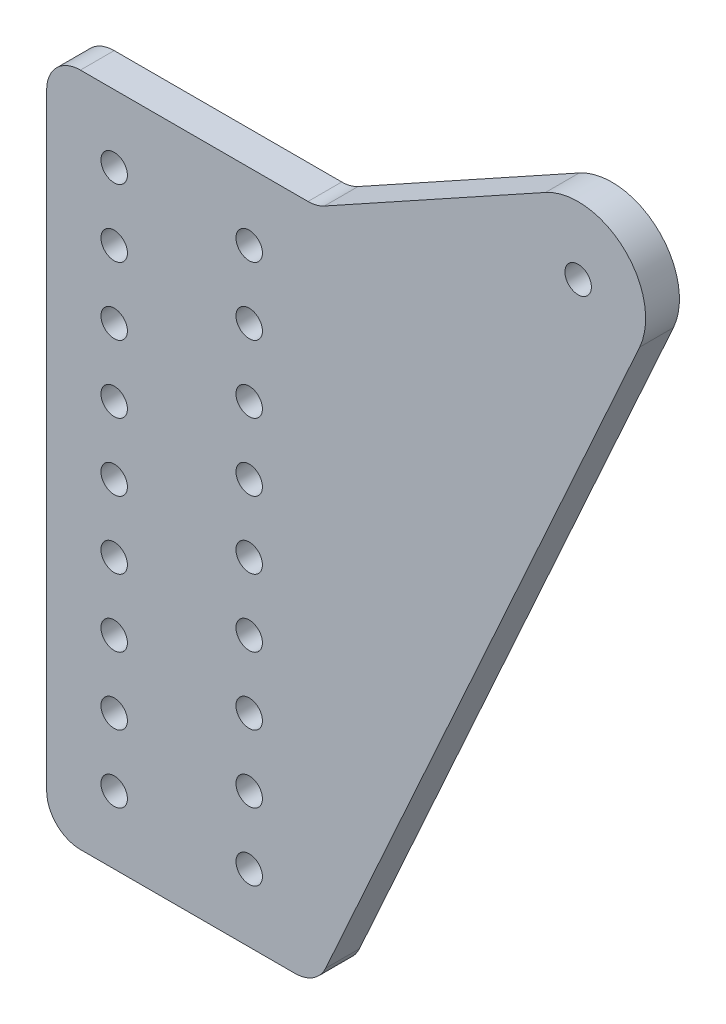
ISO-10303-21;
HEADER;
FILE_DESCRIPTION(('STEP AP214'),'2;1');
FILE_NAME('part.step','',(''),(''),'','','');
FILE_SCHEMA(('AUTOMOTIVE_DESIGN { 1 0 10303 214 1 1 1 1 }'));
ENDSEC;
DATA;
#1=APPLICATION_CONTEXT('core data for automotive mechanical design processes');
#2=APPLICATION_PROTOCOL_DEFINITION('international standard','automotive_design',2000,#1);
#3=PRODUCT_CONTEXT('',#1,'mechanical');
#4=PRODUCT('Part','Part','',(#3));
#5=PRODUCT_RELATED_PRODUCT_CATEGORY('part','',(#4));
#6=PRODUCT_DEFINITION_FORMATION('','',#4);
#7=PRODUCT_DEFINITION_CONTEXT('part definition',#1,'design');
#8=PRODUCT_DEFINITION('design','',#6,#7);
#9=PRODUCT_DEFINITION_SHAPE('','',#8);
#10=(LENGTH_UNIT() NAMED_UNIT(*) SI_UNIT(.MILLI.,.METRE.));
#11=(NAMED_UNIT(*) PLANE_ANGLE_UNIT() SI_UNIT($,.RADIAN.));
#12=(NAMED_UNIT(*) SI_UNIT($,.STERADIAN.) SOLID_ANGLE_UNIT());
#13=UNCERTAINTY_MEASURE_WITH_UNIT(LENGTH_MEASURE(1.E-05),#10,'distance_accuracy_value','');
#14=(GEOMETRIC_REPRESENTATION_CONTEXT(3) GLOBAL_UNCERTAINTY_ASSIGNED_CONTEXT((#13)) GLOBAL_UNIT_ASSIGNED_CONTEXT((#10,
#11,#12)) REPRESENTATION_CONTEXT('',''));
#15=CARTESIAN_POINT('',(0.,0.,0.));
#16=DIRECTION('',(0.,0.,1.));
#17=DIRECTION('',(1.,0.,0.));
#18=AXIS2_PLACEMENT_3D('',#15,#16,#17);
#19=CARTESIAN_POINT('',(-14.470826659618,6.53887304743332,-6.35));
#20=DIRECTION('',(0.911284099188198,-0.411778205550943,0.));
#21=DIRECTION('',(0.411778205550943,0.911284099188198,0.));
#22=AXIS2_PLACEMENT_3D('',#19,#20,#21);
#23=PLANE('',#22);
#24=DIRECTION('',(0.411778205550943,0.911284099188198,0.));
#25=VECTOR('',#24,1.);
#26=CARTESIAN_POINT('',(-14.470826659618,6.53887304743332,0.));
#27=LINE('',#26,#25);
#28=CARTESIAN_POINT('',(141.387813286241,351.461208394752,0.));
#29=VERTEX_POINT('',#28);
#30=CARTESIAN_POINT('',(200.461068727398,482.193038406938,0.));
#31=VERTEX_POINT('',#30);
#32=EDGE_CURVE('E149',#29,#31,#27,.T.);
#33=ORIENTED_EDGE('',*,*,#32,.F.);
#34=DIRECTION('',(0.,0.,1.));
#35=VECTOR('',#34,1.);
#36=CARTESIAN_POINT('',(141.387813286241,351.461208394752,-6.35));
#37=LINE('',#36,#35);
#38=CARTESIAN_POINT('',(141.387813286241,351.461208394752,-6.35));
#39=VERTEX_POINT('',#38);
#40=EDGE_CURVE('E56',#29,#39,#37,.F.);
#41=ORIENTED_EDGE('',*,*,#40,.T.);
#42=DIRECTION('',(0.411778205550943,0.911284099188198,0.));
#43=VECTOR('',#42,1.);
#44=CARTESIAN_POINT('',(-14.470826659618,6.53887304743332,-6.35));
#45=LINE('',#44,#43);
#46=CARTESIAN_POINT('',(200.461068727398,482.193038406938,-6.35));
#47=VERTEX_POINT('',#46);
#48=EDGE_CURVE('E117',#39,#47,#45,.T.);
#49=ORIENTED_EDGE('',*,*,#48,.T.);
#50=DIRECTION('',(0.,0.,1.));
#51=VECTOR('',#50,1.);
#52=CARTESIAN_POINT('',(200.461068727398,482.193038406938,-6.35));
#53=LINE('',#52,#51);
#54=EDGE_CURVE('E119',#47,#31,#53,.T.);
#55=ORIENTED_EDGE('',*,*,#54,.T.);
#56=EDGE_LOOP('',(#33,#41,#49,#55));
#57=FACE_BOUND('',#56,.T.);
#58=ADVANCED_FACE('F41',(#57),#23,.T.);
#59=CARTESIAN_POINT('',(0.,347.726,-6.35));
#60=DIRECTION('',(0.,-1.,0.));
#61=DIRECTION('',(0.,0.,-1.));
#62=AXIS2_PLACEMENT_3D('',#59,#60,#61);
#63=PLANE('',#62);
#64=DIRECTION('',(1.,0.,0.));
#65=VECTOR('',#64,1.);
#66=CARTESIAN_POINT('',(0.,347.726,0.));
#67=LINE('',#66,#65);
#68=CARTESIAN_POINT('',(95.25,347.726,0.));
#69=VERTEX_POINT('',#68);
#70=CARTESIAN_POINT('',(135.601159256395,347.726,0.));
#71=VERTEX_POINT('',#70);
#72=EDGE_CURVE('E123',#69,#71,#67,.T.);
#73=ORIENTED_EDGE('',*,*,#72,.F.);
#74=DIRECTION('',(0.,0.,1.));
#75=VECTOR('',#74,1.);
#76=CARTESIAN_POINT('',(95.25,347.726,-6.35));
#77=LINE('',#76,#75);
#78=CARTESIAN_POINT('',(95.25,347.726,-6.35));
#79=VERTEX_POINT('',#78);
#80=EDGE_CURVE('E186',#69,#79,#77,.F.);
#81=ORIENTED_EDGE('',*,*,#80,.T.);
#82=DIRECTION('',(1.,0.,0.));
#83=VECTOR('',#82,1.);
#84=CARTESIAN_POINT('',(0.,347.726,-6.35));
#85=LINE('',#84,#83);
#86=CARTESIAN_POINT('',(135.601159256395,347.726,-6.35));
#87=VERTEX_POINT('',#86);
#88=EDGE_CURVE('E132',#79,#87,#85,.T.);
#89=ORIENTED_EDGE('',*,*,#88,.T.);
#90=DIRECTION('',(0.,0.,1.));
#91=VECTOR('',#90,1.);
#92=CARTESIAN_POINT('',(135.601159256395,347.726,-6.35));
#93=LINE('',#92,#91);
#94=EDGE_CURVE('E183',#87,#71,#93,.T.);
#95=ORIENTED_EDGE('',*,*,#94,.T.);
#96=EDGE_LOOP('',(#73,#81,#89,#95));
#97=FACE_BOUND('',#96,.T.);
#98=ADVANCED_FACE('F213',(#97),#63,.T.);
#99=CARTESIAN_POINT('',(88.9,0.,-6.35));
#100=DIRECTION('',(-1.,0.,0.));
#101=DIRECTION('',(0.,-1.,0.));
#102=AXIS2_PLACEMENT_3D('',#99,#100,#101);
#103=PLANE('',#102);
#104=DIRECTION('',(0.,-1.,0.));
#105=VECTOR('',#104,1.);
#106=CARTESIAN_POINT('',(88.9,0.,-6.35));
#107=LINE('',#106,#105);
#108=CARTESIAN_POINT('',(88.9,468.376,-6.35));
#109=VERTEX_POINT('',#108);
#110=CARTESIAN_POINT('',(88.9,354.076,-6.35));
#111=VERTEX_POINT('',#110);
#112=EDGE_CURVE('E145',#109,#111,#107,.T.);
#113=ORIENTED_EDGE('',*,*,#112,.T.);
#114=DIRECTION('',(0.,0.,1.));
#115=VECTOR('',#114,1.);
#116=CARTESIAN_POINT('',(88.9,354.076,-6.35));
#117=LINE('',#116,#115);
#118=CARTESIAN_POINT('',(88.9,354.076,0.));
#119=VERTEX_POINT('',#118);
#120=EDGE_CURVE('E174',#111,#119,#117,.T.);
#121=ORIENTED_EDGE('',*,*,#120,.T.);
#122=DIRECTION('',(0.,-1.,0.));
#123=VECTOR('',#122,1.);
#124=CARTESIAN_POINT('',(88.9,0.,0.));
#125=LINE('',#124,#123);
#126=CARTESIAN_POINT('',(88.9,468.376,0.));
#127=VERTEX_POINT('',#126);
#128=EDGE_CURVE('E158',#127,#119,#125,.T.);
#129=ORIENTED_EDGE('',*,*,#128,.F.);
#130=DIRECTION('',(0.,0.,1.));
#131=VECTOR('',#130,1.);
#132=CARTESIAN_POINT('',(88.9,468.376,-6.35));
#133=LINE('',#132,#131);
#134=EDGE_CURVE('E172',#127,#109,#133,.F.);
#135=ORIENTED_EDGE('',*,*,#134,.T.);
#136=EDGE_LOOP('',(#113,#121,#129,#135));
#137=FACE_BOUND('',#136,.T.);
#138=ADVANCED_FACE('F221',(#137),#103,.T.);
#139=CARTESIAN_POINT('',(0.,474.726,-6.35));
#140=DIRECTION('',(0.,-1.,0.));
#141=DIRECTION('',(0.,0.,-1.));
#142=AXIS2_PLACEMENT_3D('',#139,#140,#141);
#143=PLANE('',#142);
#144=DIRECTION('',(1.,0.,0.));
#145=VECTOR('',#144,1.);
#146=CARTESIAN_POINT('',(0.,474.726,0.));
#147=LINE('',#146,#145);
#148=CARTESIAN_POINT('',(95.25,474.726,0.));
#149=VERTEX_POINT('',#148);
#150=CARTESIAN_POINT('',(138.060669657881,474.726,0.));
#151=VERTEX_POINT('',#150);
#152=EDGE_CURVE('E155',#149,#151,#147,.T.);
#153=ORIENTED_EDGE('',*,*,#152,.T.);
#154=DIRECTION('',(0.,0.,1.));
#155=VECTOR('',#154,1.);
#156=CARTESIAN_POINT('',(138.060669657881,474.726,-6.35));
#157=LINE('',#156,#155);
#158=CARTESIAN_POINT('',(138.060669657881,474.726,-6.35));
#159=VERTEX_POINT('',#158);
#160=EDGE_CURVE('E170',#151,#159,#157,.F.);
#161=ORIENTED_EDGE('',*,*,#160,.T.);
#162=DIRECTION('',(1.,0.,0.));
#163=VECTOR('',#162,1.);
#164=CARTESIAN_POINT('',(0.,474.726,-6.35));
#165=LINE('',#164,#163);
#166=CARTESIAN_POINT('',(95.25,474.726,-6.35));
#167=VERTEX_POINT('',#166);
#168=EDGE_CURVE('E139',#167,#159,#165,.T.);
#169=ORIENTED_EDGE('',*,*,#168,.F.);
#170=DIRECTION('',(0.,0.,1.));
#171=VECTOR('',#170,1.);
#172=CARTESIAN_POINT('',(95.25,474.726,0.));
#173=LINE('',#172,#171);
#174=EDGE_CURVE('E167',#167,#149,#173,.T.);
#175=ORIENTED_EDGE('',*,*,#174,.T.);
#176=EDGE_LOOP('',(#153,#161,#169,#175));
#177=FACE_BOUND('',#176,.T.);
#178=ADVANCED_FACE('F201',(#177),#143,.F.);
#179=CARTESIAN_POINT('',(-168.346136870146,304.316839689287,-6.35));
#180=DIRECTION('',(0.484062818627612,-0.875033249438152,0.));
#181=DIRECTION('',(0.875033249438152,0.484062818627612,0.));
#182=AXIS2_PLACEMENT_3D('',#179,#180,#181);
#183=PLANE('',#182);
#184=DIRECTION('',(0.875033249438152,0.484062818627612,0.));
#185=VECTOR('',#184,1.);
#186=CARTESIAN_POINT('',(-168.346136870146,304.316839689287,-6.35));
#187=LINE('',#186,#185);
#188=CARTESIAN_POINT('',(141.134468556167,475.519538866068,-6.35));
#189=VERTEX_POINT('',#188);
#190=CARTESIAN_POINT('',(182.740162871137,498.5355438853,-6.35));
#191=VERTEX_POINT('',#190);
#192=EDGE_CURVE('E136',#189,#191,#187,.T.);
#193=ORIENTED_EDGE('',*,*,#192,.F.);
#194=DIRECTION('',(0.,0.,1.));
#195=VECTOR('',#194,1.);
#196=CARTESIAN_POINT('',(141.134468556167,475.519538866068,0.));
#197=LINE('',#196,#195);
#198=CARTESIAN_POINT('',(141.134468556167,475.519538866068,0.));
#199=VERTEX_POINT('',#198);
#200=EDGE_CURVE('E163',#189,#199,#197,.T.);
#201=ORIENTED_EDGE('',*,*,#200,.T.);
#202=DIRECTION('',(0.875033249438152,0.484062818627612,0.));
#203=VECTOR('',#202,1.);
#204=CARTESIAN_POINT('',(-168.346136870146,304.316839689287,0.));
#205=LINE('',#204,#203);
#206=CARTESIAN_POINT('',(182.740162871137,498.5355438853,0.));
#207=VERTEX_POINT('',#206);
#208=EDGE_CURVE('E153',#199,#207,#205,.T.);
#209=ORIENTED_EDGE('',*,*,#208,.T.);
#210=DIRECTION('',(0.,0.,1.));
#211=VECTOR('',#210,1.);
#212=CARTESIAN_POINT('',(182.740162871137,498.5355438853,-6.35));
#213=LINE('',#212,#211);
#214=EDGE_CURVE('E131',#191,#207,#213,.T.);
#215=ORIENTED_EDGE('',*,*,#214,.F.);
#216=EDGE_LOOP('',(#193,#201,#209,#215));
#217=FACE_BOUND('',#216,.T.);
#218=ADVANCED_FACE('F207',(#217),#183,.F.);
#219=CARTESIAN_POINT('',(188.887760667708,487.422621617435,-6.35));
#220=DIRECTION('',(0.,0.,1.));
#221=DIRECTION('',(1.,0.,0.));
#222=AXIS2_PLACEMENT_3D('',#219,#220,#221);
#223=CYLINDRICAL_SURFACE('',#222,12.7);
#224=CARTESIAN_POINT('',(188.887760667708,487.422621617435,0.));
#225=DIRECTION('',(0.,0.,1.));
#226=DIRECTION('',(1.,0.,0.));
#227=AXIS2_PLACEMENT_3D('',#224,#225,#226);
#228=CIRCLE('',#227,12.7);
#229=EDGE_CURVE('E130',#31,#207,#228,.T.);
#230=ORIENTED_EDGE('',*,*,#229,.F.);
#231=ORIENTED_EDGE('',*,*,#54,.F.);
#232=CARTESIAN_POINT('',(188.887760667708,487.422621617435,-6.35));
#233=DIRECTION('',(0.,0.,1.));
#234=DIRECTION('',(1.,0.,0.));
#235=AXIS2_PLACEMENT_3D('',#232,#233,#234);
#236=CIRCLE('',#235,12.7);
#237=EDGE_CURVE('E122',#47,#191,#236,.T.);
#238=ORIENTED_EDGE('',*,*,#237,.T.);
#239=ORIENTED_EDGE('',*,*,#214,.T.);
#240=EDGE_LOOP('',(#230,#231,#238,#239));
#241=FACE_BOUND('',#240,.T.);
#242=ADVANCED_FACE('F127',(#241),#223,.T.);
#243=CARTESIAN_POINT('',(0.,0.,-6.35));
#244=DIRECTION('',(0.,0.,1.));
#245=DIRECTION('',(1.,0.,0.));
#246=AXIS2_PLACEMENT_3D('',#243,#244,#245);
#247=PLANE('',#246);
#248=CARTESIAN_POINT('',(127.,423.926,-6.35));
#249=DIRECTION('',(0.,0.,1.));
#250=DIRECTION('',(1.,0.,0.));
#251=AXIS2_PLACEMENT_3D('',#248,#249,#250);
#252=CIRCLE('',#251,2.48920000000003);
#253=CARTESIAN_POINT('',(129.4892,423.926,-6.35));
#254=VERTEX_POINT('',#253);
#255=EDGE_CURVE('E639',#254,#254,#252,.T.);
#256=ORIENTED_EDGE('',*,*,#255,.T.);
#257=EDGE_LOOP('',(#256));
#258=FACE_BOUND('',#257,.T.);
#259=CARTESIAN_POINT('',(127.,436.626,-6.35));
#260=DIRECTION('',(0.,0.,1.));
#261=DIRECTION('',(1.,0.,0.));
#262=AXIS2_PLACEMENT_3D('',#259,#260,#261);
#263=CIRCLE('',#262,2.48920000000003);
#264=CARTESIAN_POINT('',(129.4892,436.626,-6.35));
#265=VERTEX_POINT('',#264);
#266=EDGE_CURVE('E643',#265,#265,#263,.T.);
#267=ORIENTED_EDGE('',*,*,#266,.T.);
#268=EDGE_LOOP('',(#267));
#269=FACE_BOUND('',#268,.T.);
#270=CARTESIAN_POINT('',(127.,449.326,-6.35));
#271=DIRECTION('',(0.,0.,1.));
#272=DIRECTION('',(1.,0.,0.));
#273=AXIS2_PLACEMENT_3D('',#270,#271,#272);
#274=CIRCLE('',#273,2.48920000000003);
#275=CARTESIAN_POINT('',(129.4892,449.326,-6.35));
#276=VERTEX_POINT('',#275);
#277=EDGE_CURVE('E631',#276,#276,#274,.T.);
#278=ORIENTED_EDGE('',*,*,#277,.T.);
#279=EDGE_LOOP('',(#278));
#280=FACE_BOUND('',#279,.T.);
#281=CARTESIAN_POINT('',(101.6,360.426,-6.35));
#282=DIRECTION('',(0.,0.,1.));
#283=DIRECTION('',(1.,0.,0.));
#284=AXIS2_PLACEMENT_3D('',#281,#282,#283);
#285=CIRCLE('',#284,2.48920000000001);
#286=CARTESIAN_POINT('',(104.0892,360.426,-6.35));
#287=VERTEX_POINT('',#286);
#288=EDGE_CURVE('E635',#287,#287,#285,.T.);
#289=ORIENTED_EDGE('',*,*,#288,.T.);
#290=EDGE_LOOP('',(#289));
#291=FACE_BOUND('',#290,.T.);
#292=CARTESIAN_POINT('',(127.,411.226,-6.35));
#293=DIRECTION('',(0.,0.,1.));
#294=DIRECTION('',(1.,0.,0.));
#295=AXIS2_PLACEMENT_3D('',#292,#293,#294);
#296=CIRCLE('',#295,2.48920000000001);
#297=CARTESIAN_POINT('',(129.4892,411.226,-6.35));
#298=VERTEX_POINT('',#297);
#299=EDGE_CURVE('E659',#298,#298,#296,.T.);
#300=ORIENTED_EDGE('',*,*,#299,.T.);
#301=EDGE_LOOP('',(#300));
#302=FACE_BOUND('',#301,.T.);
#303=CARTESIAN_POINT('',(127.,398.526,-6.35));
#304=DIRECTION('',(0.,0.,1.));
#305=DIRECTION('',(1.,0.,0.));
#306=AXIS2_PLACEMENT_3D('',#303,#304,#305);
#307=CIRCLE('',#306,2.48920000000001);
#308=CARTESIAN_POINT('',(129.4892,398.526,-6.35));
#309=VERTEX_POINT('',#308);
#310=EDGE_CURVE('E655',#309,#309,#307,.T.);
#311=ORIENTED_EDGE('',*,*,#310,.T.);
#312=EDGE_LOOP('',(#311));
#313=FACE_BOUND('',#312,.T.);
#314=CARTESIAN_POINT('',(127.,385.826,-6.35));
#315=DIRECTION('',(0.,0.,1.));
#316=DIRECTION('',(1.,0.,0.));
#317=AXIS2_PLACEMENT_3D('',#314,#315,#316);
#318=CIRCLE('',#317,2.48920000000001);
#319=CARTESIAN_POINT('',(129.4892,385.826,-6.35));
#320=VERTEX_POINT('',#319);
#321=EDGE_CURVE('E651',#320,#320,#318,.T.);
#322=ORIENTED_EDGE('',*,*,#321,.T.);
#323=EDGE_LOOP('',(#322));
#324=FACE_BOUND('',#323,.T.);
#325=CARTESIAN_POINT('',(127.,373.126,-6.35));
#326=DIRECTION('',(0.,0.,1.));
#327=DIRECTION('',(1.,0.,0.));
#328=AXIS2_PLACEMENT_3D('',#325,#326,#327);
#329=CIRCLE('',#328,2.48920000000001);
#330=CARTESIAN_POINT('',(129.4892,373.126,-6.35));
#331=VERTEX_POINT('',#330);
#332=EDGE_CURVE('E647',#331,#331,#329,.T.);
#333=ORIENTED_EDGE('',*,*,#332,.T.);
#334=EDGE_LOOP('',(#333));
#335=FACE_BOUND('',#334,.T.);
#336=CARTESIAN_POINT('',(101.6,373.126,-6.35));
#337=DIRECTION('',(0.,0.,1.));
#338=DIRECTION('',(1.,0.,0.));
#339=AXIS2_PLACEMENT_3D('',#336,#337,#338);
#340=CIRCLE('',#339,2.48920000000002);
#341=CARTESIAN_POINT('',(104.0892,373.126,-6.35));
#342=VERTEX_POINT('',#341);
#343=EDGE_CURVE('E601',#342,#342,#340,.T.);
#344=ORIENTED_EDGE('',*,*,#343,.T.);
#345=EDGE_LOOP('',(#344));
#346=FACE_BOUND('',#345,.T.);
#347=CARTESIAN_POINT('',(101.6,385.826,-6.35));
#348=DIRECTION('',(0.,0.,1.));
#349=DIRECTION('',(1.,0.,0.));
#350=AXIS2_PLACEMENT_3D('',#347,#348,#349);
#351=CIRCLE('',#350,2.48920000000002);
#352=CARTESIAN_POINT('',(104.0892,385.826,-6.35));
#353=VERTEX_POINT('',#352);
#354=EDGE_CURVE('E605',#353,#353,#351,.T.);
#355=ORIENTED_EDGE('',*,*,#354,.T.);
#356=EDGE_LOOP('',(#355));
#357=FACE_BOUND('',#356,.T.);
#358=CARTESIAN_POINT('',(101.6,398.526,-6.35));
#359=DIRECTION('',(0.,0.,1.));
#360=DIRECTION('',(1.,0.,0.));
#361=AXIS2_PLACEMENT_3D('',#358,#359,#360);
#362=CIRCLE('',#361,2.48920000000002);
#363=CARTESIAN_POINT('',(104.0892,398.526,-6.35));
#364=VERTEX_POINT('',#363);
#365=EDGE_CURVE('E609',#364,#364,#362,.T.);
#366=ORIENTED_EDGE('',*,*,#365,.T.);
#367=EDGE_LOOP('',(#366));
#368=FACE_BOUND('',#367,.T.);
#369=CARTESIAN_POINT('',(101.6,411.226,-6.35));
#370=DIRECTION('',(0.,0.,1.));
#371=DIRECTION('',(1.,0.,0.));
#372=AXIS2_PLACEMENT_3D('',#369,#370,#371);
#373=CIRCLE('',#372,2.48920000000002);
#374=CARTESIAN_POINT('',(104.0892,411.226,-6.35));
#375=VERTEX_POINT('',#374);
#376=EDGE_CURVE('E613',#375,#375,#373,.T.);
#377=ORIENTED_EDGE('',*,*,#376,.T.);
#378=EDGE_LOOP('',(#377));
#379=FACE_BOUND('',#378,.T.);
#380=CARTESIAN_POINT('',(101.6,423.926,-6.35));
#381=DIRECTION('',(0.,0.,1.));
#382=DIRECTION('',(1.,0.,0.));
#383=AXIS2_PLACEMENT_3D('',#380,#381,#382);
#384=CIRCLE('',#383,2.48920000000002);
#385=CARTESIAN_POINT('',(104.0892,423.926,-6.35));
#386=VERTEX_POINT('',#385);
#387=EDGE_CURVE('E617',#386,#386,#384,.T.);
#388=ORIENTED_EDGE('',*,*,#387,.T.);
#389=EDGE_LOOP('',(#388));
#390=FACE_BOUND('',#389,.T.);
#391=CARTESIAN_POINT('',(101.6,436.626,-6.35));
#392=DIRECTION('',(0.,0.,1.));
#393=DIRECTION('',(1.,0.,0.));
#394=AXIS2_PLACEMENT_3D('',#391,#392,#393);
#395=CIRCLE('',#394,2.48920000000002);
#396=CARTESIAN_POINT('',(104.0892,436.626,-6.35));
#397=VERTEX_POINT('',#396);
#398=EDGE_CURVE('E621',#397,#397,#395,.T.);
#399=ORIENTED_EDGE('',*,*,#398,.T.);
#400=EDGE_LOOP('',(#399));
#401=FACE_BOUND('',#400,.T.);
#402=CARTESIAN_POINT('',(101.6,449.326,-6.35));
#403=DIRECTION('',(0.,0.,1.));
#404=DIRECTION('',(1.,0.,0.));
#405=AXIS2_PLACEMENT_3D('',#402,#403,#404);
#406=CIRCLE('',#405,2.48920000000002);
#407=CARTESIAN_POINT('',(104.0892,449.326,-6.35));
#408=VERTEX_POINT('',#407);
#409=EDGE_CURVE('E625',#408,#408,#406,.T.);
#410=ORIENTED_EDGE('',*,*,#409,.T.);
#411=EDGE_LOOP('',(#410));
#412=FACE_BOUND('',#411,.T.);
#413=CARTESIAN_POINT('',(188.887760667708,487.422621617435,-6.35));
#414=DIRECTION('',(0.,0.,1.));
#415=DIRECTION('',(1.,0.,0.));
#416=AXIS2_PLACEMENT_3D('',#413,#414,#415);
#417=CIRCLE('',#416,2.48920000000001);
#418=CARTESIAN_POINT('',(191.376960667708,487.422621617435,-6.35));
#419=VERTEX_POINT('',#418);
#420=EDGE_CURVE('E598',#419,#419,#417,.T.);
#421=ORIENTED_EDGE('',*,*,#420,.T.);
#422=EDGE_LOOP('',(#421));
#423=FACE_BOUND('',#422,.T.);
#424=CARTESIAN_POINT('',(127.,360.426,-6.35));
#425=DIRECTION('',(0.,0.,1.));
#426=DIRECTION('',(1.,0.,0.));
#427=AXIS2_PLACEMENT_3D('',#424,#425,#426);
#428=CIRCLE('',#427,2.48920000000001);
#429=CARTESIAN_POINT('',(129.4892,360.426,-6.35));
#430=VERTEX_POINT('',#429);
#431=EDGE_CURVE('E667',#430,#430,#428,.T.);
#432=ORIENTED_EDGE('',*,*,#431,.T.);
#433=EDGE_LOOP('',(#432));
#434=FACE_BOUND('',#433,.T.);
#435=CARTESIAN_POINT('',(127.,462.026,-6.35));
#436=DIRECTION('',(0.,0.,1.));
#437=DIRECTION('',(1.,0.,0.));
#438=AXIS2_PLACEMENT_3D('',#435,#436,#437);
#439=CIRCLE('',#438,2.48920000000003);
#440=CARTESIAN_POINT('',(129.4892,462.026,-6.35));
#441=VERTEX_POINT('',#440);
#442=EDGE_CURVE('E663',#441,#441,#439,.T.);
#443=ORIENTED_EDGE('',*,*,#442,.T.);
#444=EDGE_LOOP('',(#443));
#445=FACE_BOUND('',#444,.T.);
#446=CARTESIAN_POINT('',(101.6,462.026,-6.35));
#447=DIRECTION('',(0.,0.,1.));
#448=DIRECTION('',(1.,0.,0.));
#449=AXIS2_PLACEMENT_3D('',#446,#447,#448);
#450=CIRCLE('',#449,2.48920000000002);
#451=CARTESIAN_POINT('',(104.0892,462.026,-6.35));
#452=VERTEX_POINT('',#451);
#453=EDGE_CURVE('E151',#452,#452,#450,.T.);
#454=ORIENTED_EDGE('',*,*,#453,.T.);
#455=EDGE_LOOP('',(#454));
#456=FACE_BOUND('',#455,.T.);
#457=ORIENTED_EDGE('',*,*,#88,.F.);
#458=CARTESIAN_POINT('',(95.25,354.076,-6.35));
#459=DIRECTION('',(0.,0.,1.));
#460=DIRECTION('',(1.,0.,0.));
#461=AXIS2_PLACEMENT_3D('',#458,#459,#460);
#462=CIRCLE('',#461,6.35);
#463=EDGE_CURVE('E191',#79,#111,#462,.F.);
#464=ORIENTED_EDGE('',*,*,#463,.T.);
#465=ORIENTED_EDGE('',*,*,#112,.F.);
#466=CARTESIAN_POINT('',(95.25,468.376,-6.35));
#467=DIRECTION('',(0.,0.,1.));
#468=DIRECTION('',(1.,0.,0.));
#469=AXIS2_PLACEMENT_3D('',#466,#467,#468);
#470=CIRCLE('',#469,6.35);
#471=EDGE_CURVE('E188',#109,#167,#470,.F.);
#472=ORIENTED_EDGE('',*,*,#471,.T.);
#473=ORIENTED_EDGE('',*,*,#168,.T.);
#474=CARTESIAN_POINT('',(138.060669657881,481.076,-6.35));
#475=DIRECTION('',(0.,0.,1.));
#476=DIRECTION('',(1.,0.,0.));
#477=AXIS2_PLACEMENT_3D('',#474,#475,#476);
#478=CIRCLE('',#477,6.35);
#479=EDGE_CURVE('E11',#159,#189,#478,.T.);
#480=ORIENTED_EDGE('',*,*,#479,.T.);
#481=ORIENTED_EDGE('',*,*,#192,.T.);
#482=ORIENTED_EDGE('',*,*,#237,.F.);
#483=ORIENTED_EDGE('',*,*,#48,.F.);
#484=CARTESIAN_POINT('',(135.601159256395,354.076,-6.35));
#485=DIRECTION('',(0.,0.,1.));
#486=DIRECTION('',(1.,0.,0.));
#487=AXIS2_PLACEMENT_3D('',#484,#485,#486);
#488=CIRCLE('',#487,6.35);
#489=EDGE_CURVE('E63',#39,#87,#488,.F.);
#490=ORIENTED_EDGE('',*,*,#489,.T.);
#491=EDGE_LOOP('',(#457,#464,#465,#472,#473,#480,#481,#482,#483,#490));
#492=FACE_BOUND('',#491,.T.);
#493=ADVANCED_FACE('F134',(#258,#269,#280,#291,#302,#313,#324,#335,#346,#357,#368,#379,#390,
#401,#412,#423,#434,#445,#456,#492),#247,.F.);
#494=CARTESIAN_POINT('',(0.,0.,0.));
#495=DIRECTION('',(0.,0.,1.));
#496=DIRECTION('',(1.,0.,0.));
#497=AXIS2_PLACEMENT_3D('',#494,#495,#496);
#498=PLANE('',#497);
#499=CARTESIAN_POINT('',(127.,423.926,0.));
#500=DIRECTION('',(0.,0.,1.));
#501=DIRECTION('',(1.,0.,0.));
#502=AXIS2_PLACEMENT_3D('',#499,#500,#501);
#503=CIRCLE('',#502,2.48920000000003);
#504=CARTESIAN_POINT('',(129.4892,423.926,0.));
#505=VERTEX_POINT('',#504);
#506=EDGE_CURVE('E523',#505,#505,#503,.T.);
#507=ORIENTED_EDGE('',*,*,#506,.F.);
#508=EDGE_LOOP('',(#507));
#509=FACE_BOUND('',#508,.T.);
#510=CARTESIAN_POINT('',(127.,436.626,0.));
#511=DIRECTION('',(0.,0.,1.));
#512=DIRECTION('',(1.,0.,0.));
#513=AXIS2_PLACEMENT_3D('',#510,#511,#512);
#514=CIRCLE('',#513,2.48920000000003);
#515=CARTESIAN_POINT('',(129.4892,436.626,0.));
#516=VERTEX_POINT('',#515);
#517=EDGE_CURVE('E527',#516,#516,#514,.T.);
#518=ORIENTED_EDGE('',*,*,#517,.F.);
#519=EDGE_LOOP('',(#518));
#520=FACE_BOUND('',#519,.T.);
#521=CARTESIAN_POINT('',(127.,449.326,0.));
#522=DIRECTION('',(0.,0.,1.));
#523=DIRECTION('',(1.,0.,0.));
#524=AXIS2_PLACEMENT_3D('',#521,#522,#523);
#525=CIRCLE('',#524,2.48920000000003);
#526=CARTESIAN_POINT('',(129.4892,449.326,0.));
#527=VERTEX_POINT('',#526);
#528=EDGE_CURVE('E531',#527,#527,#525,.T.);
#529=ORIENTED_EDGE('',*,*,#528,.F.);
#530=EDGE_LOOP('',(#529));
#531=FACE_BOUND('',#530,.T.);
#532=CARTESIAN_POINT('',(101.6,360.426,0.));
#533=DIRECTION('',(0.,0.,1.));
#534=DIRECTION('',(1.,0.,0.));
#535=AXIS2_PLACEMENT_3D('',#532,#533,#534);
#536=CIRCLE('',#535,2.48920000000001);
#537=CARTESIAN_POINT('',(104.0892,360.426,0.));
#538=VERTEX_POINT('',#537);
#539=EDGE_CURVE('E535',#538,#538,#536,.T.);
#540=ORIENTED_EDGE('',*,*,#539,.F.);
#541=EDGE_LOOP('',(#540));
#542=FACE_BOUND('',#541,.T.);
#543=CARTESIAN_POINT('',(127.,411.226,0.));
#544=DIRECTION('',(0.,0.,1.));
#545=DIRECTION('',(1.,0.,0.));
#546=AXIS2_PLACEMENT_3D('',#543,#544,#545);
#547=CIRCLE('',#546,2.48920000000001);
#548=CARTESIAN_POINT('',(129.4892,411.226,0.));
#549=VERTEX_POINT('',#548);
#550=EDGE_CURVE('E539',#549,#549,#547,.T.);
#551=ORIENTED_EDGE('',*,*,#550,.F.);
#552=EDGE_LOOP('',(#551));
#553=FACE_BOUND('',#552,.T.);
#554=CARTESIAN_POINT('',(127.,398.526,0.));
#555=DIRECTION('',(0.,0.,1.));
#556=DIRECTION('',(1.,0.,0.));
#557=AXIS2_PLACEMENT_3D('',#554,#555,#556);
#558=CIRCLE('',#557,2.48920000000001);
#559=CARTESIAN_POINT('',(129.4892,398.526,0.));
#560=VERTEX_POINT('',#559);
#561=EDGE_CURVE('E543',#560,#560,#558,.T.);
#562=ORIENTED_EDGE('',*,*,#561,.F.);
#563=EDGE_LOOP('',(#562));
#564=FACE_BOUND('',#563,.T.);
#565=CARTESIAN_POINT('',(127.,385.826,0.));
#566=DIRECTION('',(0.,0.,1.));
#567=DIRECTION('',(1.,0.,0.));
#568=AXIS2_PLACEMENT_3D('',#565,#566,#567);
#569=CIRCLE('',#568,2.48920000000001);
#570=CARTESIAN_POINT('',(129.4892,385.826,0.));
#571=VERTEX_POINT('',#570);
#572=EDGE_CURVE('E547',#571,#571,#569,.T.);
#573=ORIENTED_EDGE('',*,*,#572,.F.);
#574=EDGE_LOOP('',(#573));
#575=FACE_BOUND('',#574,.T.);
#576=CARTESIAN_POINT('',(127.,373.126,0.));
#577=DIRECTION('',(0.,0.,1.));
#578=DIRECTION('',(1.,0.,0.));
#579=AXIS2_PLACEMENT_3D('',#576,#577,#578);
#580=CIRCLE('',#579,2.48920000000001);
#581=CARTESIAN_POINT('',(129.4892,373.126,0.));
#582=VERTEX_POINT('',#581);
#583=EDGE_CURVE('E551',#582,#582,#580,.T.);
#584=ORIENTED_EDGE('',*,*,#583,.F.);
#585=EDGE_LOOP('',(#584));
#586=FACE_BOUND('',#585,.T.);
#587=CARTESIAN_POINT('',(101.6,373.126,0.));
#588=DIRECTION('',(0.,0.,1.));
#589=DIRECTION('',(1.,0.,0.));
#590=AXIS2_PLACEMENT_3D('',#587,#588,#589);
#591=CIRCLE('',#590,2.48920000000002);
#592=CARTESIAN_POINT('',(104.0892,373.126,0.));
#593=VERTEX_POINT('',#592);
#594=EDGE_CURVE('E555',#593,#593,#591,.T.);
#595=ORIENTED_EDGE('',*,*,#594,.F.);
#596=EDGE_LOOP('',(#595));
#597=FACE_BOUND('',#596,.T.);
#598=CARTESIAN_POINT('',(101.6,385.826,0.));
#599=DIRECTION('',(0.,0.,1.));
#600=DIRECTION('',(1.,0.,0.));
#601=AXIS2_PLACEMENT_3D('',#598,#599,#600);
#602=CIRCLE('',#601,2.48920000000002);
#603=CARTESIAN_POINT('',(104.0892,385.826,0.));
#604=VERTEX_POINT('',#603);
#605=EDGE_CURVE('E559',#604,#604,#602,.T.);
#606=ORIENTED_EDGE('',*,*,#605,.F.);
#607=EDGE_LOOP('',(#606));
#608=FACE_BOUND('',#607,.T.);
#609=CARTESIAN_POINT('',(101.6,398.526,0.));
#610=DIRECTION('',(0.,0.,1.));
#611=DIRECTION('',(1.,0.,0.));
#612=AXIS2_PLACEMENT_3D('',#609,#610,#611);
#613=CIRCLE('',#612,2.48920000000002);
#614=CARTESIAN_POINT('',(104.0892,398.526,0.));
#615=VERTEX_POINT('',#614);
#616=EDGE_CURVE('E563',#615,#615,#613,.T.);
#617=ORIENTED_EDGE('',*,*,#616,.F.);
#618=EDGE_LOOP('',(#617));
#619=FACE_BOUND('',#618,.T.);
#620=CARTESIAN_POINT('',(101.6,411.226,0.));
#621=DIRECTION('',(0.,0.,1.));
#622=DIRECTION('',(1.,0.,0.));
#623=AXIS2_PLACEMENT_3D('',#620,#621,#622);
#624=CIRCLE('',#623,2.48920000000002);
#625=CARTESIAN_POINT('',(104.0892,411.226,0.));
#626=VERTEX_POINT('',#625);
#627=EDGE_CURVE('E567',#626,#626,#624,.T.);
#628=ORIENTED_EDGE('',*,*,#627,.F.);
#629=EDGE_LOOP('',(#628));
#630=FACE_BOUND('',#629,.T.);
#631=CARTESIAN_POINT('',(101.6,423.926,0.));
#632=DIRECTION('',(0.,0.,1.));
#633=DIRECTION('',(1.,0.,0.));
#634=AXIS2_PLACEMENT_3D('',#631,#632,#633);
#635=CIRCLE('',#634,2.48920000000002);
#636=CARTESIAN_POINT('',(104.0892,423.926,0.));
#637=VERTEX_POINT('',#636);
#638=EDGE_CURVE('E571',#637,#637,#635,.T.);
#639=ORIENTED_EDGE('',*,*,#638,.F.);
#640=EDGE_LOOP('',(#639));
#641=FACE_BOUND('',#640,.T.);
#642=CARTESIAN_POINT('',(101.6,436.626,0.));
#643=DIRECTION('',(0.,0.,1.));
#644=DIRECTION('',(1.,0.,0.));
#645=AXIS2_PLACEMENT_3D('',#642,#643,#644);
#646=CIRCLE('',#645,2.48920000000002);
#647=CARTESIAN_POINT('',(104.0892,436.626,0.));
#648=VERTEX_POINT('',#647);
#649=EDGE_CURVE('E575',#648,#648,#646,.T.);
#650=ORIENTED_EDGE('',*,*,#649,.F.);
#651=EDGE_LOOP('',(#650));
#652=FACE_BOUND('',#651,.T.);
#653=CARTESIAN_POINT('',(101.6,449.326,0.));
#654=DIRECTION('',(0.,0.,1.));
#655=DIRECTION('',(1.,0.,0.));
#656=AXIS2_PLACEMENT_3D('',#653,#654,#655);
#657=CIRCLE('',#656,2.48920000000002);
#658=CARTESIAN_POINT('',(104.0892,449.326,0.));
#659=VERTEX_POINT('',#658);
#660=EDGE_CURVE('E579',#659,#659,#657,.T.);
#661=ORIENTED_EDGE('',*,*,#660,.F.);
#662=EDGE_LOOP('',(#661));
#663=FACE_BOUND('',#662,.T.);
#664=CARTESIAN_POINT('',(188.887760667708,487.422621617435,0.));
#665=DIRECTION('',(0.,0.,1.));
#666=DIRECTION('',(1.,0.,0.));
#667=AXIS2_PLACEMENT_3D('',#664,#665,#666);
#668=CIRCLE('',#667,2.48920000000001);
#669=CARTESIAN_POINT('',(191.376960667708,487.422621617435,0.));
#670=VERTEX_POINT('',#669);
#671=EDGE_CURVE('E583',#670,#670,#668,.T.);
#672=ORIENTED_EDGE('',*,*,#671,.F.);
#673=EDGE_LOOP('',(#672));
#674=FACE_BOUND('',#673,.T.);
#675=CARTESIAN_POINT('',(127.,360.426,0.));
#676=DIRECTION('',(0.,0.,1.));
#677=DIRECTION('',(1.,0.,0.));
#678=AXIS2_PLACEMENT_3D('',#675,#676,#677);
#679=CIRCLE('',#678,2.48920000000001);
#680=CARTESIAN_POINT('',(129.4892,360.426,0.));
#681=VERTEX_POINT('',#680);
#682=EDGE_CURVE('E587',#681,#681,#679,.T.);
#683=ORIENTED_EDGE('',*,*,#682,.F.);
#684=EDGE_LOOP('',(#683));
#685=FACE_BOUND('',#684,.T.);
#686=CARTESIAN_POINT('',(127.,462.026,0.));
#687=DIRECTION('',(0.,0.,1.));
#688=DIRECTION('',(1.,0.,0.));
#689=AXIS2_PLACEMENT_3D('',#686,#687,#688);
#690=CIRCLE('',#689,2.48920000000003);
#691=CARTESIAN_POINT('',(129.4892,462.026,0.));
#692=VERTEX_POINT('',#691);
#693=EDGE_CURVE('E591',#692,#692,#690,.T.);
#694=ORIENTED_EDGE('',*,*,#693,.F.);
#695=EDGE_LOOP('',(#694));
#696=FACE_BOUND('',#695,.T.);
#697=CARTESIAN_POINT('',(101.6,462.026,0.));
#698=DIRECTION('',(0.,0.,1.));
#699=DIRECTION('',(1.,0.,0.));
#700=AXIS2_PLACEMENT_3D('',#697,#698,#699);
#701=CIRCLE('',#700,2.48920000000002);
#702=CARTESIAN_POINT('',(104.0892,462.026,0.));
#703=VERTEX_POINT('',#702);
#704=EDGE_CURVE('E594',#703,#703,#701,.T.);
#705=ORIENTED_EDGE('',*,*,#704,.F.);
#706=EDGE_LOOP('',(#705));
#707=FACE_BOUND('',#706,.T.);
#708=ORIENTED_EDGE('',*,*,#128,.T.);
#709=CARTESIAN_POINT('',(95.25,354.076,0.));
#710=DIRECTION('',(0.,0.,1.));
#711=DIRECTION('',(1.,0.,0.));
#712=AXIS2_PLACEMENT_3D('',#709,#710,#711);
#713=CIRCLE('',#712,6.35);
#714=EDGE_CURVE('E181',#119,#69,#713,.T.);
#715=ORIENTED_EDGE('',*,*,#714,.T.);
#716=ORIENTED_EDGE('',*,*,#72,.T.);
#717=CARTESIAN_POINT('',(135.601159256395,354.076,0.));
#718=DIRECTION('',(0.,0.,1.));
#719=DIRECTION('',(1.,0.,0.));
#720=AXIS2_PLACEMENT_3D('',#717,#718,#719);
#721=CIRCLE('',#720,6.35);
#722=EDGE_CURVE('E179',#71,#29,#721,.T.);
#723=ORIENTED_EDGE('',*,*,#722,.T.);
#724=ORIENTED_EDGE('',*,*,#32,.T.);
#725=ORIENTED_EDGE('',*,*,#229,.T.);
#726=ORIENTED_EDGE('',*,*,#208,.F.);
#727=CARTESIAN_POINT('',(138.060669657881,481.076,0.));
#728=DIRECTION('',(0.,0.,1.));
#729=DIRECTION('',(1.,0.,0.));
#730=AXIS2_PLACEMENT_3D('',#727,#728,#729);
#731=CIRCLE('',#730,6.35);
#732=EDGE_CURVE('E49',#199,#151,#731,.F.);
#733=ORIENTED_EDGE('',*,*,#732,.T.);
#734=ORIENTED_EDGE('',*,*,#152,.F.);
#735=CARTESIAN_POINT('',(95.25,468.376,0.));
#736=DIRECTION('',(0.,0.,1.));
#737=DIRECTION('',(1.,0.,0.));
#738=AXIS2_PLACEMENT_3D('',#735,#736,#737);
#739=CIRCLE('',#738,6.35);
#740=EDGE_CURVE('E177',#149,#127,#739,.T.);
#741=ORIENTED_EDGE('',*,*,#740,.T.);
#742=EDGE_LOOP('',(#708,#715,#716,#723,#724,#725,#726,#733,#734,#741));
#743=FACE_BOUND('',#742,.T.);
#744=ADVANCED_FACE('F196',(#509,#520,#531,#542,#553,#564,#575,#586,#597,#608,#619,#630,#641,
#652,#663,#674,#685,#696,#707,#743),#498,.T.);
#745=CARTESIAN_POINT('',(138.060669657881,481.076,-6.35));
#746=DIRECTION('',(0.,0.,-1.));
#747=DIRECTION('',(-1.,0.,0.));
#748=AXIS2_PLACEMENT_3D('',#745,#746,#747);
#749=CYLINDRICAL_SURFACE('',#748,6.35);
#750=ORIENTED_EDGE('',*,*,#479,.F.);
#751=ORIENTED_EDGE('',*,*,#160,.F.);
#752=ORIENTED_EDGE('',*,*,#732,.F.);
#753=ORIENTED_EDGE('',*,*,#200,.F.);
#754=EDGE_LOOP('',(#750,#751,#752,#753));
#755=FACE_BOUND('',#754,.T.);
#756=ADVANCED_FACE('F205',(#755),#749,.F.);
#757=CARTESIAN_POINT('',(95.25,354.076,-6.35));
#758=DIRECTION('',(0.,0.,1.));
#759=DIRECTION('',(1.,0.,0.));
#760=AXIS2_PLACEMENT_3D('',#757,#758,#759);
#761=CYLINDRICAL_SURFACE('',#760,6.35);
#762=ORIENTED_EDGE('',*,*,#463,.F.);
#763=ORIENTED_EDGE('',*,*,#80,.F.);
#764=ORIENTED_EDGE('',*,*,#714,.F.);
#765=ORIENTED_EDGE('',*,*,#120,.F.);
#766=EDGE_LOOP('',(#762,#763,#764,#765));
#767=FACE_BOUND('',#766,.T.);
#768=ADVANCED_FACE('F219',(#767),#761,.T.);
#769=CARTESIAN_POINT('',(135.601159256395,354.076,-6.35));
#770=DIRECTION('',(0.,0.,1.));
#771=DIRECTION('',(1.,0.,0.));
#772=AXIS2_PLACEMENT_3D('',#769,#770,#771);
#773=CYLINDRICAL_SURFACE('',#772,6.35);
#774=ORIENTED_EDGE('',*,*,#489,.F.);
#775=ORIENTED_EDGE('',*,*,#40,.F.);
#776=ORIENTED_EDGE('',*,*,#722,.F.);
#777=ORIENTED_EDGE('',*,*,#94,.F.);
#778=EDGE_LOOP('',(#774,#775,#776,#777));
#779=FACE_BOUND('',#778,.T.);
#780=ADVANCED_FACE('F209',(#779),#773,.T.);
#781=CARTESIAN_POINT('',(95.25,468.376,-6.35));
#782=DIRECTION('',(0.,0.,-1.));
#783=DIRECTION('',(-1.,0.,0.));
#784=AXIS2_PLACEMENT_3D('',#781,#782,#783);
#785=CYLINDRICAL_SURFACE('',#784,6.35);
#786=ORIENTED_EDGE('',*,*,#471,.F.);
#787=ORIENTED_EDGE('',*,*,#134,.F.);
#788=ORIENTED_EDGE('',*,*,#740,.F.);
#789=ORIENTED_EDGE('',*,*,#174,.F.);
#790=EDGE_LOOP('',(#786,#787,#788,#789));
#791=FACE_BOUND('',#790,.T.);
#792=ADVANCED_FACE('F43',(#791),#785,.T.);
#793=CARTESIAN_POINT('',(101.6,462.026,-6.35));
#794=DIRECTION('',(0.,0.,1.));
#795=DIRECTION('',(1.,0.,0.));
#796=AXIS2_PLACEMENT_3D('',#793,#794,#795);
#797=CYLINDRICAL_SURFACE('',#796,2.48920000000002);
#798=ORIENTED_EDGE('',*,*,#453,.F.);
#799=EDGE_LOOP('',(#798));
#800=FACE_BOUND('',#799,.T.);
#801=ORIENTED_EDGE('',*,*,#704,.T.);
#802=EDGE_LOOP('',(#801));
#803=FACE_BOUND('',#802,.T.);
#804=ADVANCED_FACE('F227',(#800,#803),#797,.F.);
#805=CARTESIAN_POINT('',(127.,462.026,-6.35));
#806=DIRECTION('',(0.,0.,1.));
#807=DIRECTION('',(1.,0.,0.));
#808=AXIS2_PLACEMENT_3D('',#805,#806,#807);
#809=CYLINDRICAL_SURFACE('',#808,2.48920000000003);
#810=ORIENTED_EDGE('',*,*,#442,.F.);
#811=EDGE_LOOP('',(#810));
#812=FACE_BOUND('',#811,.T.);
#813=ORIENTED_EDGE('',*,*,#693,.T.);
#814=EDGE_LOOP('',(#813));
#815=FACE_BOUND('',#814,.T.);
#816=ADVANCED_FACE('F233',(#812,#815),#809,.F.);
#817=CARTESIAN_POINT('',(127.,360.426,-6.35));
#818=DIRECTION('',(0.,0.,1.));
#819=DIRECTION('',(1.,0.,0.));
#820=AXIS2_PLACEMENT_3D('',#817,#818,#819);
#821=CYLINDRICAL_SURFACE('',#820,2.48920000000001);
#822=ORIENTED_EDGE('',*,*,#431,.F.);
#823=EDGE_LOOP('',(#822));
#824=FACE_BOUND('',#823,.T.);
#825=ORIENTED_EDGE('',*,*,#682,.T.);
#826=EDGE_LOOP('',(#825));
#827=FACE_BOUND('',#826,.T.);
#828=ADVANCED_FACE('F280',(#824,#827),#821,.F.);
#829=CARTESIAN_POINT('',(188.887760667708,487.422621617435,-6.35));
#830=DIRECTION('',(0.,0.,1.));
#831=DIRECTION('',(1.,0.,0.));
#832=AXIS2_PLACEMENT_3D('',#829,#830,#831);
#833=CYLINDRICAL_SURFACE('',#832,2.48920000000001);
#834=ORIENTED_EDGE('',*,*,#420,.F.);
#835=EDGE_LOOP('',(#834));
#836=FACE_BOUND('',#835,.T.);
#837=ORIENTED_EDGE('',*,*,#671,.T.);
#838=EDGE_LOOP('',(#837));
#839=FACE_BOUND('',#838,.T.);
#840=ADVANCED_FACE('F290',(#836,#839),#833,.F.);
#841=CARTESIAN_POINT('',(101.6,449.326,-6.35));
#842=DIRECTION('',(0.,0.,1.));
#843=DIRECTION('',(1.,0.,0.));
#844=AXIS2_PLACEMENT_3D('',#841,#842,#843);
#845=CYLINDRICAL_SURFACE('',#844,2.48920000000002);
#846=ORIENTED_EDGE('',*,*,#409,.F.);
#847=EDGE_LOOP('',(#846));
#848=FACE_BOUND('',#847,.T.);
#849=ORIENTED_EDGE('',*,*,#660,.T.);
#850=EDGE_LOOP('',(#849));
#851=FACE_BOUND('',#850,.T.);
#852=ADVANCED_FACE('F300',(#848,#851),#845,.F.);
#853=CARTESIAN_POINT('',(101.6,436.626,-6.35));
#854=DIRECTION('',(0.,0.,1.));
#855=DIRECTION('',(1.,0.,0.));
#856=AXIS2_PLACEMENT_3D('',#853,#854,#855);
#857=CYLINDRICAL_SURFACE('',#856,2.48920000000002);
#858=ORIENTED_EDGE('',*,*,#398,.F.);
#859=EDGE_LOOP('',(#858));
#860=FACE_BOUND('',#859,.T.);
#861=ORIENTED_EDGE('',*,*,#649,.T.);
#862=EDGE_LOOP('',(#861));
#863=FACE_BOUND('',#862,.T.);
#864=ADVANCED_FACE('F310',(#860,#863),#857,.F.);
#865=CARTESIAN_POINT('',(101.6,423.926,-6.35));
#866=DIRECTION('',(0.,0.,1.));
#867=DIRECTION('',(1.,0.,0.));
#868=AXIS2_PLACEMENT_3D('',#865,#866,#867);
#869=CYLINDRICAL_SURFACE('',#868,2.48920000000002);
#870=ORIENTED_EDGE('',*,*,#387,.F.);
#871=EDGE_LOOP('',(#870));
#872=FACE_BOUND('',#871,.T.);
#873=ORIENTED_EDGE('',*,*,#638,.T.);
#874=EDGE_LOOP('',(#873));
#875=FACE_BOUND('',#874,.T.);
#876=ADVANCED_FACE('F320',(#872,#875),#869,.F.);
#877=CARTESIAN_POINT('',(101.6,411.226,-6.35));
#878=DIRECTION('',(0.,0.,1.));
#879=DIRECTION('',(1.,0.,0.));
#880=AXIS2_PLACEMENT_3D('',#877,#878,#879);
#881=CYLINDRICAL_SURFACE('',#880,2.48920000000002);
#882=ORIENTED_EDGE('',*,*,#376,.F.);
#883=EDGE_LOOP('',(#882));
#884=FACE_BOUND('',#883,.T.);
#885=ORIENTED_EDGE('',*,*,#627,.T.);
#886=EDGE_LOOP('',(#885));
#887=FACE_BOUND('',#886,.T.);
#888=ADVANCED_FACE('F330',(#884,#887),#881,.F.);
#889=CARTESIAN_POINT('',(101.6,398.526,-6.35));
#890=DIRECTION('',(0.,0.,1.));
#891=DIRECTION('',(1.,0.,0.));
#892=AXIS2_PLACEMENT_3D('',#889,#890,#891);
#893=CYLINDRICAL_SURFACE('',#892,2.48920000000002);
#894=ORIENTED_EDGE('',*,*,#365,.F.);
#895=EDGE_LOOP('',(#894));
#896=FACE_BOUND('',#895,.T.);
#897=ORIENTED_EDGE('',*,*,#616,.T.);
#898=EDGE_LOOP('',(#897));
#899=FACE_BOUND('',#898,.T.);
#900=ADVANCED_FACE('F340',(#896,#899),#893,.F.);
#901=CARTESIAN_POINT('',(101.6,385.826,-6.35));
#902=DIRECTION('',(0.,0.,1.));
#903=DIRECTION('',(1.,0.,0.));
#904=AXIS2_PLACEMENT_3D('',#901,#902,#903);
#905=CYLINDRICAL_SURFACE('',#904,2.48920000000002);
#906=ORIENTED_EDGE('',*,*,#354,.F.);
#907=EDGE_LOOP('',(#906));
#908=FACE_BOUND('',#907,.T.);
#909=ORIENTED_EDGE('',*,*,#605,.T.);
#910=EDGE_LOOP('',(#909));
#911=FACE_BOUND('',#910,.T.);
#912=ADVANCED_FACE('F350',(#908,#911),#905,.F.);
#913=CARTESIAN_POINT('',(101.6,373.126,-6.35));
#914=DIRECTION('',(0.,0.,1.));
#915=DIRECTION('',(1.,0.,0.));
#916=AXIS2_PLACEMENT_3D('',#913,#914,#915);
#917=CYLINDRICAL_SURFACE('',#916,2.48920000000002);
#918=ORIENTED_EDGE('',*,*,#343,.F.);
#919=EDGE_LOOP('',(#918));
#920=FACE_BOUND('',#919,.T.);
#921=ORIENTED_EDGE('',*,*,#594,.T.);
#922=EDGE_LOOP('',(#921));
#923=FACE_BOUND('',#922,.T.);
#924=ADVANCED_FACE('F360',(#920,#923),#917,.F.);
#925=CARTESIAN_POINT('',(127.,373.126,-6.35));
#926=DIRECTION('',(0.,0.,1.));
#927=DIRECTION('',(1.,0.,0.));
#928=AXIS2_PLACEMENT_3D('',#925,#926,#927);
#929=CYLINDRICAL_SURFACE('',#928,2.48920000000001);
#930=ORIENTED_EDGE('',*,*,#332,.F.);
#931=EDGE_LOOP('',(#930));
#932=FACE_BOUND('',#931,.T.);
#933=ORIENTED_EDGE('',*,*,#583,.T.);
#934=EDGE_LOOP('',(#933));
#935=FACE_BOUND('',#934,.T.);
#936=ADVANCED_FACE('F370',(#932,#935),#929,.F.);
#937=CARTESIAN_POINT('',(127.,385.826,-6.35));
#938=DIRECTION('',(0.,0.,1.));
#939=DIRECTION('',(1.,0.,0.));
#940=AXIS2_PLACEMENT_3D('',#937,#938,#939);
#941=CYLINDRICAL_SURFACE('',#940,2.48920000000001);
#942=ORIENTED_EDGE('',*,*,#321,.F.);
#943=EDGE_LOOP('',(#942));
#944=FACE_BOUND('',#943,.T.);
#945=ORIENTED_EDGE('',*,*,#572,.T.);
#946=EDGE_LOOP('',(#945));
#947=FACE_BOUND('',#946,.T.);
#948=ADVANCED_FACE('F380',(#944,#947),#941,.F.);
#949=CARTESIAN_POINT('',(127.,398.526,-6.35));
#950=DIRECTION('',(0.,0.,1.));
#951=DIRECTION('',(1.,0.,0.));
#952=AXIS2_PLACEMENT_3D('',#949,#950,#951);
#953=CYLINDRICAL_SURFACE('',#952,2.48920000000001);
#954=ORIENTED_EDGE('',*,*,#310,.F.);
#955=EDGE_LOOP('',(#954));
#956=FACE_BOUND('',#955,.T.);
#957=ORIENTED_EDGE('',*,*,#561,.T.);
#958=EDGE_LOOP('',(#957));
#959=FACE_BOUND('',#958,.T.);
#960=ADVANCED_FACE('F390',(#956,#959),#953,.F.);
#961=CARTESIAN_POINT('',(127.,411.226,-6.35));
#962=DIRECTION('',(0.,0.,1.));
#963=DIRECTION('',(1.,0.,0.));
#964=AXIS2_PLACEMENT_3D('',#961,#962,#963);
#965=CYLINDRICAL_SURFACE('',#964,2.48920000000001);
#966=ORIENTED_EDGE('',*,*,#299,.F.);
#967=EDGE_LOOP('',(#966));
#968=FACE_BOUND('',#967,.T.);
#969=ORIENTED_EDGE('',*,*,#550,.T.);
#970=EDGE_LOOP('',(#969));
#971=FACE_BOUND('',#970,.T.);
#972=ADVANCED_FACE('F400',(#968,#971),#965,.F.);
#973=CARTESIAN_POINT('',(101.6,360.426,-6.35));
#974=DIRECTION('',(0.,0.,1.));
#975=DIRECTION('',(1.,0.,0.));
#976=AXIS2_PLACEMENT_3D('',#973,#974,#975);
#977=CYLINDRICAL_SURFACE('',#976,2.48920000000001);
#978=ORIENTED_EDGE('',*,*,#288,.F.);
#979=EDGE_LOOP('',(#978));
#980=FACE_BOUND('',#979,.T.);
#981=ORIENTED_EDGE('',*,*,#539,.T.);
#982=EDGE_LOOP('',(#981));
#983=FACE_BOUND('',#982,.T.);
#984=ADVANCED_FACE('F410',(#980,#983),#977,.F.);
#985=CARTESIAN_POINT('',(127.,449.326,-6.35));
#986=DIRECTION('',(0.,0.,1.));
#987=DIRECTION('',(1.,0.,0.));
#988=AXIS2_PLACEMENT_3D('',#985,#986,#987);
#989=CYLINDRICAL_SURFACE('',#988,2.48920000000003);
#990=ORIENTED_EDGE('',*,*,#277,.F.);
#991=EDGE_LOOP('',(#990));
#992=FACE_BOUND('',#991,.T.);
#993=ORIENTED_EDGE('',*,*,#528,.T.);
#994=EDGE_LOOP('',(#993));
#995=FACE_BOUND('',#994,.T.);
#996=ADVANCED_FACE('F420',(#992,#995),#989,.F.);
#997=CARTESIAN_POINT('',(127.,436.626,-6.35));
#998=DIRECTION('',(0.,0.,1.));
#999=DIRECTION('',(1.,0.,0.));
#1000=AXIS2_PLACEMENT_3D('',#997,#998,#999);
#1001=CYLINDRICAL_SURFACE('',#1000,2.48920000000003);
#1002=ORIENTED_EDGE('',*,*,#266,.F.);
#1003=EDGE_LOOP('',(#1002));
#1004=FACE_BOUND('',#1003,.T.);
#1005=ORIENTED_EDGE('',*,*,#517,.T.);
#1006=EDGE_LOOP('',(#1005));
#1007=FACE_BOUND('',#1006,.T.);
#1008=ADVANCED_FACE('F430',(#1004,#1007),#1001,.F.);
#1009=CARTESIAN_POINT('',(127.,423.926,-6.35));
#1010=DIRECTION('',(0.,0.,1.));
#1011=DIRECTION('',(1.,0.,0.));
#1012=AXIS2_PLACEMENT_3D('',#1009,#1010,#1011);
#1013=CYLINDRICAL_SURFACE('',#1012,2.48920000000003);
#1014=ORIENTED_EDGE('',*,*,#255,.F.);
#1015=EDGE_LOOP('',(#1014));
#1016=FACE_BOUND('',#1015,.T.);
#1017=ORIENTED_EDGE('',*,*,#506,.T.);
#1018=EDGE_LOOP('',(#1017));
#1019=FACE_BOUND('',#1018,.T.);
#1020=ADVANCED_FACE('F440',(#1016,#1019),#1013,.F.);
#1021=CLOSED_SHELL('',(#58,#98,#138,#178,#218,#242,#493,#744,#756,#768,#780,#792,#804,#816,#828,
#840,#852,#864,#876,#888,#900,#912,#924,#936,#948,#960,#972,#984,#996,#1008,#1020));
#1022=MANIFOLD_SOLID_BREP('B2',#1021);
#1023=ADVANCED_BREP_SHAPE_REPRESENTATION('',(#18,#1022),#14);
#1024=SHAPE_DEFINITION_REPRESENTATION(#9,#1023);
ENDSEC;
END-ISO-10303-21;
